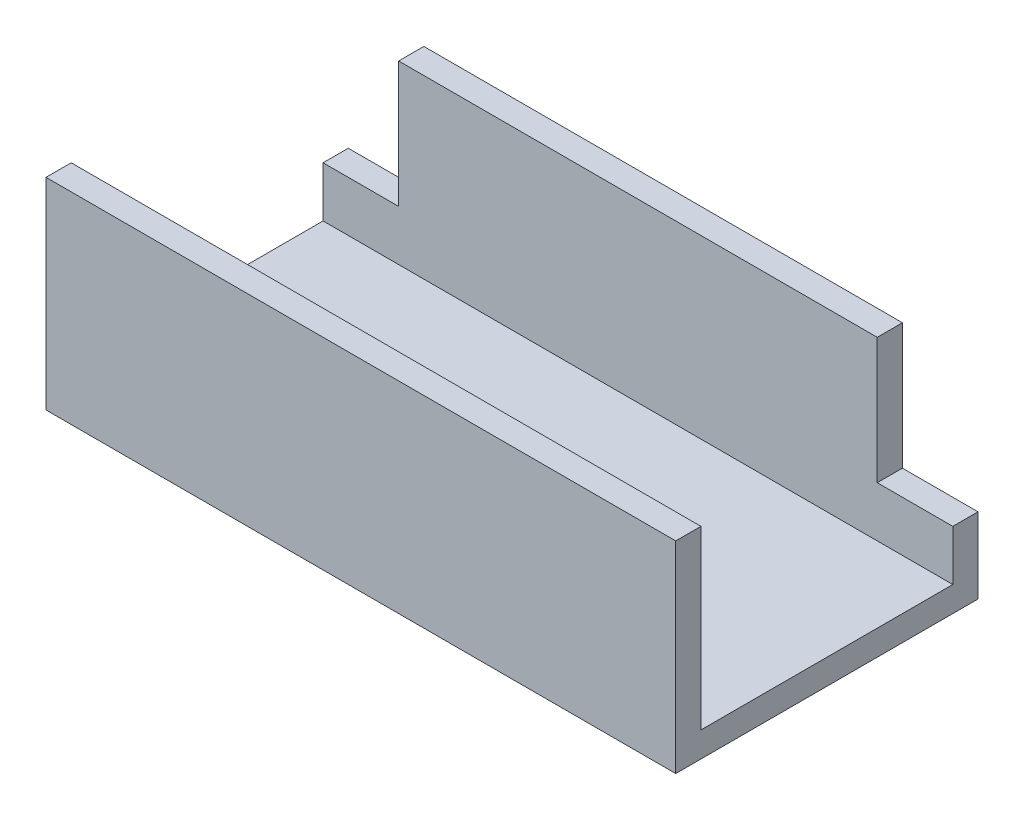
ISO-10303-21;
HEADER;
FILE_DESCRIPTION(('STEP AP214'),'2;1');
FILE_NAME('part.step','',(''),(''),'','','');
FILE_SCHEMA(('AUTOMOTIVE_DESIGN { 1 0 10303 214 1 1 1 1 }'));
ENDSEC;
DATA;
#1=APPLICATION_CONTEXT('core data for automotive mechanical design processes');
#2=APPLICATION_PROTOCOL_DEFINITION('international standard','automotive_design',2000,#1);
#3=PRODUCT_CONTEXT('',#1,'mechanical');
#4=PRODUCT('Part','Part','',(#3));
#5=PRODUCT_RELATED_PRODUCT_CATEGORY('part','',(#4));
#6=PRODUCT_DEFINITION_FORMATION('','',#4);
#7=PRODUCT_DEFINITION_CONTEXT('part definition',#1,'design');
#8=PRODUCT_DEFINITION('design','',#6,#7);
#9=PRODUCT_DEFINITION_SHAPE('','',#8);
#10=(LENGTH_UNIT() NAMED_UNIT(*) SI_UNIT(.MILLI.,.METRE.));
#11=(NAMED_UNIT(*) PLANE_ANGLE_UNIT() SI_UNIT($,.RADIAN.));
#12=(NAMED_UNIT(*) SI_UNIT($,.STERADIAN.) SOLID_ANGLE_UNIT());
#13=UNCERTAINTY_MEASURE_WITH_UNIT(LENGTH_MEASURE(1.E-05),#10,'distance_accuracy_value','');
#14=(GEOMETRIC_REPRESENTATION_CONTEXT(3) GLOBAL_UNCERTAINTY_ASSIGNED_CONTEXT((#13)) GLOBAL_UNIT_ASSIGNED_CONTEXT((#10,
#11,#12)) REPRESENTATION_CONTEXT('',''));
#15=CARTESIAN_POINT('',(0.,0.,0.));
#16=DIRECTION('',(0.,0.,1.));
#17=DIRECTION('',(1.,0.,0.));
#18=AXIS2_PLACEMENT_3D('',#15,#16,#17);
#19=CARTESIAN_POINT('',(90.6449999999998,70.139,0.00100000009742453));
#20=DIRECTION('',(-1.,0.,-2.05103306050651E-10));
#21=DIRECTION('',(-2.05103306050651E-10,0.,1.));
#22=AXIS2_PLACEMENT_3D('',#19,#20,#21);
#23=PLANE('',#22);
#24=DIRECTION('',(0.,0.,-1.));
#25=VECTOR('',#24,1.);
#26=CARTESIAN_POINT('',(90.6450000001128,69.889,0.00100000012819013));
#27=LINE('',#26,#25);
#28=CARTESIAN_POINT('',(90.6450000001128,69.889,-0.549999999894885));
#29=VERTEX_POINT('',#28);
#30=CARTESIAN_POINT('',(90.6450000001179,69.889,-0.599999999902576));
#31=VERTEX_POINT('',#30);
#32=EDGE_CURVE('E123',#29,#31,#27,.T.);
#33=ORIENTED_EDGE('',*,*,#32,.T.);
#34=DIRECTION('',(0.,1.,0.));
#35=VECTOR('',#34,1.);
#36=CARTESIAN_POINT('',(90.6450000001231,68.5130003996803,-0.599999999902576));
#37=LINE('',#36,#35);
#38=CARTESIAN_POINT('',(90.6450000001231,70.139,-0.599999999951288));
#39=VERTEX_POINT('',#38);
#40=EDGE_CURVE('E113',#31,#39,#37,.T.);
#41=ORIENTED_EDGE('',*,*,#40,.T.);
#42=DIRECTION('',(0.,0.,1.));
#43=VECTOR('',#42,1.);
#44=CARTESIAN_POINT('',(90.6450000001231,70.139,-0.59999999987181));
#45=LINE('',#44,#43);
#46=CARTESIAN_POINT('',(90.6450000001154,70.139,-0.549999999902576));
#47=VERTEX_POINT('',#46);
#48=EDGE_CURVE('E20',#39,#47,#45,.T.);
#49=ORIENTED_EDGE('',*,*,#48,.T.);
#50=DIRECTION('',(0.,1.,0.));
#51=VECTOR('',#50,1.);
#52=CARTESIAN_POINT('',(90.6450000001128,68.5130003996803,-0.549999999902576));
#53=LINE('',#52,#51);
#54=EDGE_CURVE('E110',#47,#29,#53,.F.);
#55=ORIENTED_EDGE('',*,*,#54,.T.);
#56=EDGE_LOOP('',(#33,#41,#49,#55));
#57=FACE_BOUND('',#56,.T.);
#58=ADVANCED_FACE('F17',(#57),#23,.F.);
#59=CARTESIAN_POINT('',(90.7950000001231,70.139,-0.59999999987181));
#60=DIRECTION('',(0.,-1.,0.));
#61=DIRECTION('',(1.,0.,0.));
#62=AXIS2_PLACEMENT_3D('',#59,#60,#61);
#63=PLANE('',#62);
#64=DIRECTION('',(2.05103306050651E-10,0.,-1.));
#65=VECTOR('',#64,1.);
#66=CARTESIAN_POINT('',(89.6949999999998,70.139,0.000999999902576388));
#67=LINE('',#66,#65);
#68=CARTESIAN_POINT('',(89.6950000001179,70.139,-0.600000000097424));
#69=VERTEX_POINT('',#68);
#70=CARTESIAN_POINT('',(89.6950000001128,70.139,-0.550000000048712));
#71=VERTEX_POINT('',#70);
#72=EDGE_CURVE('E116',#69,#71,#67,.F.);
#73=ORIENTED_EDGE('',*,*,#72,.T.);
#74=DIRECTION('',(-1.,0.,-2.05103306050651E-10));
#75=VECTOR('',#74,1.);
#76=CARTESIAN_POINT('',(89.5450000001128,70.139,-0.55000000012819));
#77=LINE('',#76,#75);
#78=EDGE_CURVE('E118',#71,#47,#77,.F.);
#79=ORIENTED_EDGE('',*,*,#78,.T.);
#80=ORIENTED_EDGE('',*,*,#48,.F.);
#81=DIRECTION('',(1.,0.,2.05103306050651E-10));
#82=VECTOR('',#81,1.);
#83=CARTESIAN_POINT('',(90.7950000001231,70.139,-0.599999999871811));
#84=LINE('',#83,#82);
#85=EDGE_CURVE('E164',#39,#69,#84,.F.);
#86=ORIENTED_EDGE('',*,*,#85,.T.);
#87=EDGE_LOOP('',(#73,#79,#80,#86));
#88=FACE_BOUND('',#87,.T.);
#89=ADVANCED_FACE('F119',(#88),#63,.F.);
#90=CARTESIAN_POINT('',(89.6949999999998,70.139,0.000999999902576388));
#91=DIRECTION('',(1.,0.,2.05103306050651E-10));
#92=DIRECTION('',(2.05103306050651E-10,0.,-1.));
#93=AXIS2_PLACEMENT_3D('',#90,#91,#92);
#94=PLANE('',#93);
#95=ORIENTED_EDGE('',*,*,#72,.F.);
#96=DIRECTION('',(0.,1.,0.));
#97=VECTOR('',#96,1.);
#98=CARTESIAN_POINT('',(89.6950000001231,68.5130003996803,-0.600000000097425));
#99=LINE('',#98,#97);
#100=CARTESIAN_POINT('',(89.6950000001231,69.889,-0.600000000105115));
#101=VERTEX_POINT('',#100);
#102=EDGE_CURVE('E166',#69,#101,#99,.F.);
#103=ORIENTED_EDGE('',*,*,#102,.T.);
#104=DIRECTION('',(0.,0.,-1.));
#105=VECTOR('',#104,1.);
#106=CARTESIAN_POINT('',(89.6950000001231,69.889,0.000999999871811));
#107=LINE('',#106,#105);
#108=CARTESIAN_POINT('',(89.695000000118,69.889,-0.550000000097424));
#109=VERTEX_POINT('',#108);
#110=EDGE_CURVE('E103',#101,#109,#107,.F.);
#111=ORIENTED_EDGE('',*,*,#110,.T.);
#112=DIRECTION('',(0.,1.,0.));
#113=VECTOR('',#112,1.);
#114=CARTESIAN_POINT('',(89.6950000001128,68.5130003996803,-0.550000000097424));
#115=LINE('',#114,#113);
#116=EDGE_CURVE('E124',#109,#71,#115,.T.);
#117=ORIENTED_EDGE('',*,*,#116,.T.);
#118=EDGE_LOOP('',(#95,#103,#111,#117));
#119=FACE_BOUND('',#118,.T.);
#120=ADVANCED_FACE('F248',(#119),#94,.F.);
#121=CARTESIAN_POINT('',(89.5449999999998,69.889,0.000999999871811));
#122=DIRECTION('',(0.,-1.,0.));
#123=DIRECTION('',(0.,0.,-1.));
#124=AXIS2_PLACEMENT_3D('',#121,#122,#123);
#125=PLANE('',#124);
#126=ORIENTED_EDGE('',*,*,#110,.F.);
#127=DIRECTION('',(1.,0.,2.05103306050651E-10));
#128=VECTOR('',#127,1.);
#129=CARTESIAN_POINT('',(90.7950000001231,69.889,-0.599999999871811));
#130=LINE('',#129,#128);
#131=CARTESIAN_POINT('',(89.5450000001205,69.889,-0.60000000012819));
#132=VERTEX_POINT('',#131);
#133=EDGE_CURVE('E168',#101,#132,#130,.F.);
#134=ORIENTED_EDGE('',*,*,#133,.T.);
#135=DIRECTION('',(2.05103306050651E-10,0.,-1.));
#136=VECTOR('',#135,1.);
#137=CARTESIAN_POINT('',(89.5450000001231,69.889,-0.60000000012819));
#138=LINE('',#137,#136);
#139=CARTESIAN_POINT('',(89.5450000001128,69.889,-0.550000000112807));
#140=VERTEX_POINT('',#139);
#141=EDGE_CURVE('E153',#132,#140,#138,.F.);
#142=ORIENTED_EDGE('',*,*,#141,.T.);
#143=DIRECTION('',(-1.,0.,-2.05103306050651E-10));
#144=VECTOR('',#143,1.);
#145=CARTESIAN_POINT('',(89.5450000001128,69.889,-0.55000000012819));
#146=LINE('',#145,#144);
#147=EDGE_CURVE('E133',#140,#109,#146,.F.);
#148=ORIENTED_EDGE('',*,*,#147,.T.);
#149=EDGE_LOOP('',(#126,#134,#142,#148));
#150=FACE_BOUND('',#149,.T.);
#151=ADVANCED_FACE('F247',(#150),#125,.F.);
#152=CARTESIAN_POINT('',(89.5450000000103,69.789,-0.0500000001281895));
#153=DIRECTION('',(-2.05103306050651E-10,0.,1.));
#154=DIRECTION('',(1.,0.,2.05103306050651E-10));
#155=AXIS2_PLACEMENT_3D('',#152,#153,#154);
#156=PLANE('',#155);
#157=DIRECTION('',(0.,1.,0.));
#158=VECTOR('',#157,1.);
#159=CARTESIAN_POINT('',(90.7950000000102,68.5130003996803,-0.0499999998718104));
#160=LINE('',#159,#158);
#161=CARTESIAN_POINT('',(90.7950000000051,70.139,-0.0499999998718103));
#162=VERTEX_POINT('',#161);
#163=CARTESIAN_POINT('',(90.7950000000103,69.789,-0.0499999999359051));
#164=VERTEX_POINT('',#163);
#165=EDGE_CURVE('E174',#162,#164,#160,.F.);
#166=ORIENTED_EDGE('',*,*,#165,.T.);
#167=DIRECTION('',(-1.,0.,0.));
#168=VECTOR('',#167,1.);
#169=CARTESIAN_POINT('',(89.5450000001128,69.789,-0.0500000001281895));
#170=LINE('',#169,#168);
#171=CARTESIAN_POINT('',(89.5450000000615,69.789,-0.0500000001281895));
#172=VERTEX_POINT('',#171);
#173=EDGE_CURVE('E131',#172,#164,#170,.F.);
#174=ORIENTED_EDGE('',*,*,#173,.F.);
#175=DIRECTION('',(0.,1.,0.));
#176=VECTOR('',#175,1.);
#177=CARTESIAN_POINT('',(89.5450000000103,68.5130003996803,-0.0500000001281895));
#178=LINE('',#177,#176);
#179=CARTESIAN_POINT('',(89.5450000000103,70.139,-0.0500000000640947));
#180=VERTEX_POINT('',#179);
#181=EDGE_CURVE('E149',#172,#180,#178,.T.);
#182=ORIENTED_EDGE('',*,*,#181,.T.);
#183=DIRECTION('',(-1.,0.,0.));
#184=VECTOR('',#183,1.);
#185=CARTESIAN_POINT('',(90.1700000000051,70.139,-0.0499999998718103));
#186=LINE('',#185,#184);
#187=EDGE_CURVE('E143',#162,#180,#186,.T.);
#188=ORIENTED_EDGE('',*,*,#187,.F.);
#189=EDGE_LOOP('',(#166,#174,#182,#188));
#190=FACE_BOUND('',#189,.T.);
#191=ADVANCED_FACE('F256',(#190),#156,.F.);
#192=CARTESIAN_POINT('',(89.5450000001128,69.789,-0.55000000012819));
#193=DIRECTION('',(0.,1.,0.));
#194=DIRECTION('',(-1.,0.,0.));
#195=AXIS2_PLACEMENT_3D('',#192,#193,#194);
#196=PLANE('',#195);
#197=DIRECTION('',(2.05103306050651E-10,0.,-1.));
#198=VECTOR('',#197,1.);
#199=CARTESIAN_POINT('',(89.5450000001231,69.789,-0.60000000012819));
#200=LINE('',#199,#198);
#201=CARTESIAN_POINT('',(89.5450000001128,69.789,-0.55));
#202=VERTEX_POINT('',#201);
#203=EDGE_CURVE('E146',#202,#172,#200,.F.);
#204=ORIENTED_EDGE('',*,*,#203,.T.);
#205=ORIENTED_EDGE('',*,*,#173,.T.);
#206=DIRECTION('',(-2.05105474454996E-10,0.,1.));
#207=VECTOR('',#206,1.);
#208=CARTESIAN_POINT('',(90.7950000001128,69.789,-0.549999999871811));
#209=LINE('',#208,#207);
#210=CARTESIAN_POINT('',(90.7950000000615,69.789,-0.549999999871811));
#211=VERTEX_POINT('',#210);
#212=EDGE_CURVE('E176',#164,#211,#209,.F.);
#213=ORIENTED_EDGE('',*,*,#212,.T.);
#214=DIRECTION('',(-1.,0.,-2.05103306050651E-10));
#215=VECTOR('',#214,1.);
#216=CARTESIAN_POINT('',(89.5450000001128,69.789,-0.55000000012819));
#217=LINE('',#216,#215);
#218=EDGE_CURVE('E130',#211,#202,#217,.T.);
#219=ORIENTED_EDGE('',*,*,#218,.T.);
#220=EDGE_LOOP('',(#204,#205,#213,#219));
#221=FACE_BOUND('',#220,.T.);
#222=ADVANCED_FACE('F223',(#221),#196,.T.);
#223=CARTESIAN_POINT('',(89.5450000001128,68.5130003996803,-0.55000000012819));
#224=DIRECTION('',(2.05103306050651E-10,0.,-1.));
#225=DIRECTION('',(-1.,0.,-2.05103306050651E-10));
#226=AXIS2_PLACEMENT_3D('',#223,#224,#225);
#227=PLANE('',#226);
#228=ORIENTED_EDGE('',*,*,#116,.F.);
#229=ORIENTED_EDGE('',*,*,#147,.F.);
#230=DIRECTION('',(0.,1.,0.));
#231=VECTOR('',#230,1.);
#232=CARTESIAN_POINT('',(89.5450000001128,68.5130003996803,-0.55000000012819));
#233=LINE('',#232,#231);
#234=EDGE_CURVE('E155',#140,#202,#233,.F.);
#235=ORIENTED_EDGE('',*,*,#234,.T.);
#236=ORIENTED_EDGE('',*,*,#218,.F.);
#237=DIRECTION('',(0.,1.,0.));
#238=VECTOR('',#237,1.);
#239=CARTESIAN_POINT('',(90.7950000001128,68.5130003996803,-0.549999999871811));
#240=LINE('',#239,#238);
#241=CARTESIAN_POINT('',(90.7950000001154,69.889,-0.549999999871811));
#242=VERTEX_POINT('',#241);
#243=EDGE_CURVE('E178',#211,#242,#240,.T.);
#244=ORIENTED_EDGE('',*,*,#243,.T.);
#245=DIRECTION('',(1.,0.,0.));
#246=VECTOR('',#245,1.);
#247=CARTESIAN_POINT('',(90.7949999999998,69.889,-0.549999999871811));
#248=LINE('',#247,#246);
#249=EDGE_CURVE('E128',#242,#29,#248,.F.);
#250=ORIENTED_EDGE('',*,*,#249,.T.);
#251=ORIENTED_EDGE('',*,*,#54,.F.);
#252=ORIENTED_EDGE('',*,*,#78,.F.);
#253=EDGE_LOOP('',(#228,#229,#235,#236,#244,#250,#251,#252));
#254=FACE_BOUND('',#253,.T.);
#255=ADVANCED_FACE('F126',(#254),#227,.F.);
#256=CARTESIAN_POINT('',(90.7949999999998,69.889,0.00100000012819013));
#257=DIRECTION('',(0.,-1.,0.));
#258=DIRECTION('',(0.,0.,-1.));
#259=AXIS2_PLACEMENT_3D('',#256,#257,#258);
#260=PLANE('',#259);
#261=DIRECTION('',(-2.05105474454996E-10,0.,1.));
#262=VECTOR('',#261,1.);
#263=CARTESIAN_POINT('',(90.7950000001128,69.889,-0.549999999871811));
#264=LINE('',#263,#262);
#265=CARTESIAN_POINT('',(90.7950000001231,69.889,-0.599999999887193));
#266=VERTEX_POINT('',#265);
#267=EDGE_CURVE('E180',#242,#266,#264,.F.);
#268=ORIENTED_EDGE('',*,*,#267,.T.);
#269=DIRECTION('',(1.,0.,2.05103306050651E-10));
#270=VECTOR('',#269,1.);
#271=CARTESIAN_POINT('',(90.7950000001231,69.889,-0.599999999871811));
#272=LINE('',#271,#270);
#273=EDGE_CURVE('E160',#266,#31,#272,.F.);
#274=ORIENTED_EDGE('',*,*,#273,.T.);
#275=ORIENTED_EDGE('',*,*,#32,.F.);
#276=ORIENTED_EDGE('',*,*,#249,.F.);
#277=EDGE_LOOP('',(#268,#274,#275,#276));
#278=FACE_BOUND('',#277,.T.);
#279=ADVANCED_FACE('F211',(#278),#260,.F.);
#280=CARTESIAN_POINT('',(90.1700000000051,70.139,-0.025));
#281=DIRECTION('',(0.,1.,0.));
#282=DIRECTION('',(-1.,0.,0.));
#283=AXIS2_PLACEMENT_3D('',#280,#281,#282);
#284=PLANE('',#283);
#285=DIRECTION('',(2.05103306050651E-10,0.,-1.));
#286=VECTOR('',#285,1.);
#287=CARTESIAN_POINT('',(89.5450000001231,70.139,-0.60000000012819));
#288=LINE('',#287,#286);
#289=CARTESIAN_POINT('',(89.5450000000026,70.139,-1.28189563010718E-10));
#290=VERTEX_POINT('',#289);
#291=EDGE_CURVE('E151',#180,#290,#288,.F.);
#292=ORIENTED_EDGE('',*,*,#291,.T.);
#293=DIRECTION('',(-1.,0.,-2.05103306050651E-10));
#294=VECTOR('',#293,1.);
#295=CARTESIAN_POINT('',(90.795,70.139,1.28189566281657E-10));
#296=LINE('',#295,#294);
#297=CARTESIAN_POINT('',(90.795,70.139,6.40948882119784E-11));
#298=VERTEX_POINT('',#297);
#299=EDGE_CURVE('E188',#290,#298,#296,.F.);
#300=ORIENTED_EDGE('',*,*,#299,.T.);
#301=DIRECTION('',(-2.05105474454996E-10,0.,1.));
#302=VECTOR('',#301,1.);
#303=CARTESIAN_POINT('',(90.7950000001128,70.139,-0.549999999871811));
#304=LINE('',#303,#302);
#305=EDGE_CURVE('E171',#298,#162,#304,.F.);
#306=ORIENTED_EDGE('',*,*,#305,.T.);
#307=ORIENTED_EDGE('',*,*,#187,.T.);
#308=EDGE_LOOP('',(#292,#300,#306,#307));
#309=FACE_BOUND('',#308,.T.);
#310=ADVANCED_FACE('F213',(#309),#284,.T.);
#311=CARTESIAN_POINT('',(89.5450000001231,68.5130003996803,-0.60000000012819));
#312=DIRECTION('',(1.,0.,2.05103306050651E-10));
#313=DIRECTION('',(2.05103306050651E-10,0.,-1.));
#314=AXIS2_PLACEMENT_3D('',#311,#312,#313);
#315=PLANE('',#314);
#316=ORIENTED_EDGE('',*,*,#141,.F.);
#317=DIRECTION('',(0.,1.,0.));
#318=VECTOR('',#317,1.);
#319=CARTESIAN_POINT('',(89.5450000001231,68.5130003996803,-0.60000000012819));
#320=LINE('',#319,#318);
#321=CARTESIAN_POINT('',(89.5450000000923,69.739,-0.60000000012819));
#322=VERTEX_POINT('',#321);
#323=EDGE_CURVE('E158',#132,#322,#320,.F.);
#324=ORIENTED_EDGE('',*,*,#323,.T.);
#325=DIRECTION('',(0.,0.,1.));
#326=VECTOR('',#325,1.);
#327=CARTESIAN_POINT('',(89.545,69.739,-0.599999999871811));
#328=LINE('',#327,#326);
#329=CARTESIAN_POINT('',(89.545,69.739,-6.40947272757184E-11));
#330=VERTEX_POINT('',#329);
#331=EDGE_CURVE('E191',#330,#322,#328,.F.);
#332=ORIENTED_EDGE('',*,*,#331,.F.);
#333=DIRECTION('',(0.,1.,0.));
#334=VECTOR('',#333,1.);
#335=CARTESIAN_POINT('',(89.545,69.739,-1.28189566281657E-10));
#336=LINE('',#335,#334);
#337=EDGE_CURVE('E185',#330,#290,#336,.T.);
#338=ORIENTED_EDGE('',*,*,#337,.T.);
#339=ORIENTED_EDGE('',*,*,#291,.F.);
#340=ORIENTED_EDGE('',*,*,#181,.F.);
#341=ORIENTED_EDGE('',*,*,#203,.F.);
#342=ORIENTED_EDGE('',*,*,#234,.F.);
#343=EDGE_LOOP('',(#316,#324,#332,#338,#339,#340,#341,#342));
#344=FACE_BOUND('',#343,.T.);
#345=ADVANCED_FACE('F220',(#344),#315,.F.);
#346=CARTESIAN_POINT('',(90.7950000001231,68.5130003996803,-0.599999999871811));
#347=DIRECTION('',(-2.05103306050651E-10,0.,1.));
#348=DIRECTION('',(1.,0.,2.05103306050651E-10));
#349=AXIS2_PLACEMENT_3D('',#346,#347,#348);
#350=PLANE('',#349);
#351=ORIENTED_EDGE('',*,*,#102,.F.);
#352=ORIENTED_EDGE('',*,*,#85,.F.);
#353=ORIENTED_EDGE('',*,*,#40,.F.);
#354=ORIENTED_EDGE('',*,*,#273,.F.);
#355=DIRECTION('',(0.,1.,0.));
#356=VECTOR('',#355,1.);
#357=CARTESIAN_POINT('',(90.7950000001231,68.5130003996803,-0.59999999987181));
#358=LINE('',#357,#356);
#359=CARTESIAN_POINT('',(90.7950000001231,69.739,-0.599999999935905));
#360=VERTEX_POINT('',#359);
#361=EDGE_CURVE('E182',#266,#360,#358,.F.);
#362=ORIENTED_EDGE('',*,*,#361,.T.);
#363=DIRECTION('',(1.,0.,0.));
#364=VECTOR('',#363,1.);
#365=CARTESIAN_POINT('',(90.7950000001231,69.739,-0.60000000012819));
#366=LINE('',#365,#364);
#367=EDGE_CURVE('E194',#322,#360,#366,.T.);
#368=ORIENTED_EDGE('',*,*,#367,.F.);
#369=ORIENTED_EDGE('',*,*,#323,.F.);
#370=ORIENTED_EDGE('',*,*,#133,.F.);
#371=EDGE_LOOP('',(#351,#352,#353,#354,#362,#368,#369,#370));
#372=FACE_BOUND('',#371,.T.);
#373=ADVANCED_FACE('F208',(#372),#350,.F.);
#374=CARTESIAN_POINT('',(90.7950000001128,68.5130003996803,-0.549999999871811));
#375=DIRECTION('',(-1.,0.,-2.05105474454996E-10));
#376=DIRECTION('',(-2.05105474454996E-10,0.,1.));
#377=AXIS2_PLACEMENT_3D('',#374,#375,#376);
#378=PLANE('',#377);
#379=ORIENTED_EDGE('',*,*,#267,.F.);
#380=ORIENTED_EDGE('',*,*,#243,.F.);
#381=ORIENTED_EDGE('',*,*,#212,.F.);
#382=ORIENTED_EDGE('',*,*,#165,.F.);
#383=ORIENTED_EDGE('',*,*,#305,.F.);
#384=DIRECTION('',(0.,1.,0.));
#385=VECTOR('',#384,1.);
#386=CARTESIAN_POINT('',(90.795,69.739,1.28189566281657E-10));
#387=LINE('',#386,#385);
#388=CARTESIAN_POINT('',(90.7950000000308,69.739,1.28189723946979E-10));
#389=VERTEX_POINT('',#388);
#390=EDGE_CURVE('E35',#298,#389,#387,.F.);
#391=ORIENTED_EDGE('',*,*,#390,.T.);
#392=DIRECTION('',(0.,0.,1.));
#393=VECTOR('',#392,1.);
#394=CARTESIAN_POINT('',(90.7950000001231,69.739,-0.599999999871811));
#395=LINE('',#394,#393);
#396=EDGE_CURVE('E26',#360,#389,#395,.T.);
#397=ORIENTED_EDGE('',*,*,#396,.F.);
#398=ORIENTED_EDGE('',*,*,#361,.F.);
#399=EDGE_LOOP('',(#379,#380,#381,#382,#383,#391,#397,#398));
#400=FACE_BOUND('',#399,.T.);
#401=ADVANCED_FACE('F203',(#400),#378,.F.);
#402=CARTESIAN_POINT('',(90.795,69.739,1.28189566281657E-10));
#403=DIRECTION('',(2.05103306050651E-10,0.,-1.));
#404=DIRECTION('',(-1.,0.,-2.05103306050651E-10));
#405=AXIS2_PLACEMENT_3D('',#402,#403,#404);
#406=PLANE('',#405);
#407=ORIENTED_EDGE('',*,*,#337,.F.);
#408=DIRECTION('',(1.,0.,0.));
#409=VECTOR('',#408,1.);
#410=CARTESIAN_POINT('',(90.7950000001231,69.739,1.28189776502086E-10));
#411=LINE('',#410,#409);
#412=EDGE_CURVE('E11',#389,#330,#411,.F.);
#413=ORIENTED_EDGE('',*,*,#412,.F.);
#414=ORIENTED_EDGE('',*,*,#390,.F.);
#415=ORIENTED_EDGE('',*,*,#299,.F.);
#416=EDGE_LOOP('',(#407,#413,#414,#415));
#417=FACE_BOUND('',#416,.T.);
#418=ADVANCED_FACE('F226',(#417),#406,.F.);
#419=CARTESIAN_POINT('',(90.7950000001231,69.739,-0.599999999871811));
#420=DIRECTION('',(0.,-1.,0.));
#421=DIRECTION('',(1.,0.,0.));
#422=AXIS2_PLACEMENT_3D('',#419,#420,#421);
#423=PLANE('',#422);
#424=ORIENTED_EDGE('',*,*,#396,.T.);
#425=ORIENTED_EDGE('',*,*,#412,.T.);
#426=ORIENTED_EDGE('',*,*,#331,.T.);
#427=ORIENTED_EDGE('',*,*,#367,.T.);
#428=EDGE_LOOP('',(#424,#425,#426,#427));
#429=FACE_BOUND('',#428,.T.);
#430=ADVANCED_FACE('F199',(#429),#423,.T.);
#431=CLOSED_SHELL('',(#58,#89,#120,#151,#191,#222,#255,#279,#310,#345,#373,#401,#418,#430));
#432=MANIFOLD_SOLID_BREP('B1',#431);
#433=ADVANCED_BREP_SHAPE_REPRESENTATION('',(#18,#432),#14);
#434=SHAPE_DEFINITION_REPRESENTATION(#9,#433);
ENDSEC;
END-ISO-10303-21;
